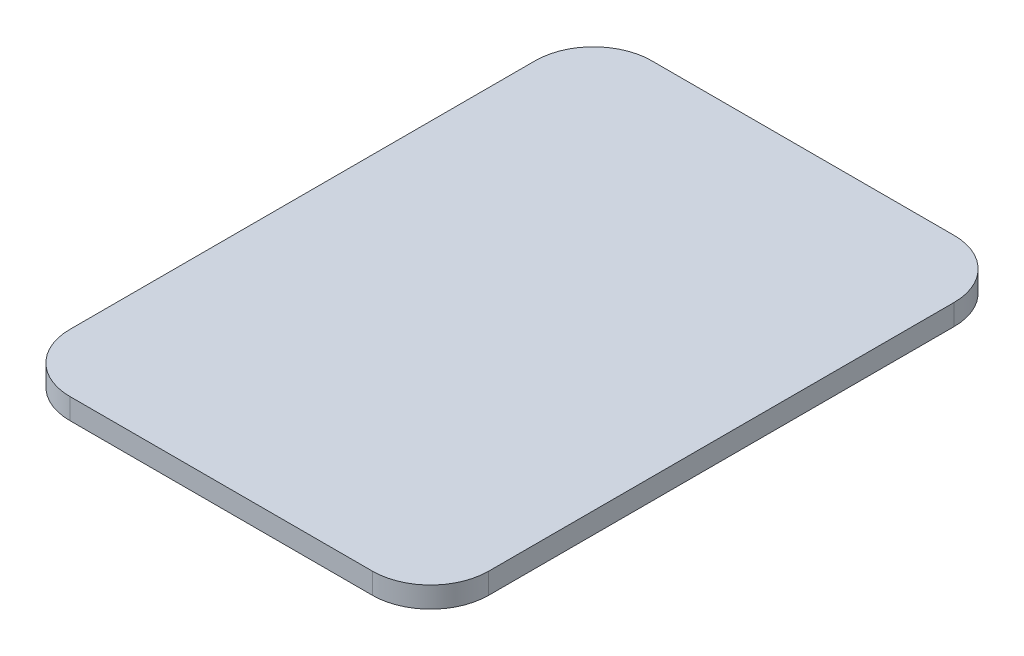
ISO-10303-21;
HEADER;
FILE_DESCRIPTION(('STEP AP214'),'2;1');
FILE_NAME('part.step','',(''),(''),'','','');
FILE_SCHEMA(('AUTOMOTIVE_DESIGN { 1 0 10303 214 1 1 1 1 }'));
ENDSEC;
DATA;
#1=APPLICATION_CONTEXT('core data for automotive mechanical design processes');
#2=APPLICATION_PROTOCOL_DEFINITION('international standard','automotive_design',2000,#1);
#3=PRODUCT_CONTEXT('',#1,'mechanical');
#4=PRODUCT('Part','Part','',(#3));
#5=PRODUCT_RELATED_PRODUCT_CATEGORY('part','',(#4));
#6=PRODUCT_DEFINITION_FORMATION('','',#4);
#7=PRODUCT_DEFINITION_CONTEXT('part definition',#1,'design');
#8=PRODUCT_DEFINITION('design','',#6,#7);
#9=PRODUCT_DEFINITION_SHAPE('','',#8);
#10=(LENGTH_UNIT() NAMED_UNIT(*) SI_UNIT(.MILLI.,.METRE.));
#11=(NAMED_UNIT(*) PLANE_ANGLE_UNIT() SI_UNIT($,.RADIAN.));
#12=(NAMED_UNIT(*) SI_UNIT($,.STERADIAN.) SOLID_ANGLE_UNIT());
#13=UNCERTAINTY_MEASURE_WITH_UNIT(LENGTH_MEASURE(1.E-05),#10,'distance_accuracy_value','');
#14=(GEOMETRIC_REPRESENTATION_CONTEXT(3) GLOBAL_UNCERTAINTY_ASSIGNED_CONTEXT((#13)) GLOBAL_UNIT_ASSIGNED_CONTEXT((#10,
#11,#12)) REPRESENTATION_CONTEXT('',''));
#15=CARTESIAN_POINT('',(0.,0.,0.));
#16=DIRECTION('',(0.,0.,1.));
#17=DIRECTION('',(1.,0.,0.));
#18=AXIS2_PLACEMENT_3D('',#15,#16,#17);
#19=CARTESIAN_POINT('',(65.,9.,-100.));
#20=DIRECTION('',(0.,-1.,0.));
#21=DIRECTION('',(0.,0.,-1.));
#22=AXIS2_PLACEMENT_3D('',#19,#20,#21);
#23=CYLINDRICAL_SURFACE('',#22,25.);
#24=CARTESIAN_POINT('',(65.,0.,-100.));
#25=DIRECTION('',(0.,1.,0.));
#26=DIRECTION('',(0.,0.,-1.));
#27=AXIS2_PLACEMENT_3D('',#24,#25,#26);
#28=CIRCLE('',#27,25.);
#29=CARTESIAN_POINT('',(90.,0.,-100.));
#30=VERTEX_POINT('',#29);
#31=CARTESIAN_POINT('',(65.,0.,-125.));
#32=VERTEX_POINT('',#31);
#33=EDGE_CURVE('E135',#30,#32,#28,.T.);
#34=ORIENTED_EDGE('',*,*,#33,.T.);
#35=DIRECTION('',(0.,-1.,0.));
#36=VECTOR('',#35,1.);
#37=CARTESIAN_POINT('',(65.,9.,-125.));
#38=LINE('',#37,#36);
#39=CARTESIAN_POINT('',(65.,9.,-125.));
#40=VERTEX_POINT('',#39);
#41=EDGE_CURVE('E11',#40,#32,#38,.T.);
#42=ORIENTED_EDGE('',*,*,#41,.F.);
#43=CARTESIAN_POINT('',(65.,9.,-100.));
#44=DIRECTION('',(0.,1.,0.));
#45=DIRECTION('',(0.,0.,-1.));
#46=AXIS2_PLACEMENT_3D('',#43,#44,#45);
#47=CIRCLE('',#46,25.);
#48=CARTESIAN_POINT('',(90.,9.,-100.));
#49=VERTEX_POINT('',#48);
#50=EDGE_CURVE('E149',#49,#40,#47,.T.);
#51=ORIENTED_EDGE('',*,*,#50,.F.);
#52=DIRECTION('',(0.,-1.,0.));
#53=VECTOR('',#52,1.);
#54=CARTESIAN_POINT('',(90.,9.,-100.));
#55=LINE('',#54,#53);
#56=EDGE_CURVE('E131',#49,#30,#55,.T.);
#57=ORIENTED_EDGE('',*,*,#56,.T.);
#58=EDGE_LOOP('',(#34,#42,#51,#57));
#59=FACE_BOUND('',#58,.T.);
#60=ADVANCED_FACE('F39',(#59),#23,.T.);
#61=CARTESIAN_POINT('',(-65.,9.,-125.));
#62=DIRECTION('',(0.,0.,1.));
#63=DIRECTION('',(1.,0.,0.));
#64=AXIS2_PLACEMENT_3D('',#61,#62,#63);
#65=PLANE('',#64);
#66=DIRECTION('',(-1.,0.,0.));
#67=VECTOR('',#66,1.);
#68=CARTESIAN_POINT('',(-65.,0.,-125.));
#69=LINE('',#68,#67);
#70=CARTESIAN_POINT('',(-65.,0.,-125.));
#71=VERTEX_POINT('',#70);
#72=EDGE_CURVE('E138',#32,#71,#69,.T.);
#73=ORIENTED_EDGE('',*,*,#72,.T.);
#74=DIRECTION('',(0.,-1.,0.));
#75=VECTOR('',#74,1.);
#76=CARTESIAN_POINT('',(-65.,9.,-125.));
#77=LINE('',#76,#75);
#78=CARTESIAN_POINT('',(-65.,9.,-125.));
#79=VERTEX_POINT('',#78);
#80=EDGE_CURVE('E47',#79,#71,#77,.T.);
#81=ORIENTED_EDGE('',*,*,#80,.F.);
#82=DIRECTION('',(-1.,0.,0.));
#83=VECTOR('',#82,1.);
#84=CARTESIAN_POINT('',(-65.,9.,-125.));
#85=LINE('',#84,#83);
#86=EDGE_CURVE('E98',#40,#79,#85,.T.);
#87=ORIENTED_EDGE('',*,*,#86,.F.);
#88=ORIENTED_EDGE('',*,*,#41,.T.);
#89=EDGE_LOOP('',(#73,#81,#87,#88));
#90=FACE_BOUND('',#89,.T.);
#91=ADVANCED_FACE('F184',(#90),#65,.F.);
#92=CARTESIAN_POINT('',(-65.,9.,-100.));
#93=DIRECTION('',(0.,-1.,0.));
#94=DIRECTION('',(0.,0.,-1.));
#95=AXIS2_PLACEMENT_3D('',#92,#93,#94);
#96=CYLINDRICAL_SURFACE('',#95,25.);
#97=CARTESIAN_POINT('',(-65.,0.,-100.));
#98=DIRECTION('',(0.,1.,0.));
#99=DIRECTION('',(0.,0.,-1.));
#100=AXIS2_PLACEMENT_3D('',#97,#98,#99);
#101=CIRCLE('',#100,25.);
#102=CARTESIAN_POINT('',(-90.,0.,-100.));
#103=VERTEX_POINT('',#102);
#104=EDGE_CURVE('E140',#71,#103,#101,.T.);
#105=ORIENTED_EDGE('',*,*,#104,.T.);
#106=DIRECTION('',(0.,-1.,0.));
#107=VECTOR('',#106,1.);
#108=CARTESIAN_POINT('',(-90.,9.,-100.));
#109=LINE('',#108,#107);
#110=CARTESIAN_POINT('',(-90.,9.,-100.));
#111=VERTEX_POINT('',#110);
#112=EDGE_CURVE('E156',#111,#103,#109,.T.);
#113=ORIENTED_EDGE('',*,*,#112,.F.);
#114=CARTESIAN_POINT('',(-65.,9.,-100.));
#115=DIRECTION('',(0.,1.,0.));
#116=DIRECTION('',(0.,0.,-1.));
#117=AXIS2_PLACEMENT_3D('',#114,#115,#116);
#118=CIRCLE('',#117,25.);
#119=EDGE_CURVE('E164',#79,#111,#118,.T.);
#120=ORIENTED_EDGE('',*,*,#119,.F.);
#121=ORIENTED_EDGE('',*,*,#80,.T.);
#122=EDGE_LOOP('',(#105,#113,#120,#121));
#123=FACE_BOUND('',#122,.T.);
#124=ADVANCED_FACE('F162',(#123),#96,.T.);
#125=CARTESIAN_POINT('',(-90.,9.,100.));
#126=DIRECTION('',(1.,0.,0.));
#127=DIRECTION('',(0.,0.,-1.));
#128=AXIS2_PLACEMENT_3D('',#125,#126,#127);
#129=PLANE('',#128);
#130=DIRECTION('',(0.,0.,1.));
#131=VECTOR('',#130,1.);
#132=CARTESIAN_POINT('',(-90.,0.,100.));
#133=LINE('',#132,#131);
#134=CARTESIAN_POINT('',(-90.,0.,100.));
#135=VERTEX_POINT('',#134);
#136=EDGE_CURVE('E142',#103,#135,#133,.T.);
#137=ORIENTED_EDGE('',*,*,#136,.T.);
#138=DIRECTION('',(0.,-1.,0.));
#139=VECTOR('',#138,1.);
#140=CARTESIAN_POINT('',(-90.,9.,100.));
#141=LINE('',#140,#139);
#142=CARTESIAN_POINT('',(-90.,9.,100.));
#143=VERTEX_POINT('',#142);
#144=EDGE_CURVE('E153',#143,#135,#141,.T.);
#145=ORIENTED_EDGE('',*,*,#144,.F.);
#146=DIRECTION('',(0.,0.,1.));
#147=VECTOR('',#146,1.);
#148=CARTESIAN_POINT('',(-90.,9.,100.));
#149=LINE('',#148,#147);
#150=EDGE_CURVE('E176',#111,#143,#149,.T.);
#151=ORIENTED_EDGE('',*,*,#150,.F.);
#152=ORIENTED_EDGE('',*,*,#112,.T.);
#153=EDGE_LOOP('',(#137,#145,#151,#152));
#154=FACE_BOUND('',#153,.T.);
#155=ADVANCED_FACE('F172',(#154),#129,.F.);
#156=CARTESIAN_POINT('',(-65.,9.,100.));
#157=DIRECTION('',(0.,-1.,0.));
#158=DIRECTION('',(0.,0.,-1.));
#159=AXIS2_PLACEMENT_3D('',#156,#157,#158);
#160=CYLINDRICAL_SURFACE('',#159,25.);
#161=CARTESIAN_POINT('',(-65.,0.,100.));
#162=DIRECTION('',(0.,1.,0.));
#163=DIRECTION('',(0.,0.,-1.));
#164=AXIS2_PLACEMENT_3D('',#161,#162,#163);
#165=CIRCLE('',#164,25.);
#166=CARTESIAN_POINT('',(-65.,0.,125.));
#167=VERTEX_POINT('',#166);
#168=EDGE_CURVE('E144',#135,#167,#165,.T.);
#169=ORIENTED_EDGE('',*,*,#168,.T.);
#170=DIRECTION('',(0.,-1.,0.));
#171=VECTOR('',#170,1.);
#172=CARTESIAN_POINT('',(-65.,9.,125.));
#173=LINE('',#172,#171);
#174=CARTESIAN_POINT('',(-65.,9.,125.));
#175=VERTEX_POINT('',#174);
#176=EDGE_CURVE('E126',#175,#167,#173,.T.);
#177=ORIENTED_EDGE('',*,*,#176,.F.);
#178=CARTESIAN_POINT('',(-65.,9.,100.));
#179=DIRECTION('',(0.,1.,0.));
#180=DIRECTION('',(0.,0.,-1.));
#181=AXIS2_PLACEMENT_3D('',#178,#179,#180);
#182=CIRCLE('',#181,25.);
#183=EDGE_CURVE('E117',#143,#175,#182,.T.);
#184=ORIENTED_EDGE('',*,*,#183,.F.);
#185=ORIENTED_EDGE('',*,*,#144,.T.);
#186=EDGE_LOOP('',(#169,#177,#184,#185));
#187=FACE_BOUND('',#186,.T.);
#188=ADVANCED_FACE('F175',(#187),#160,.T.);
#189=CARTESIAN_POINT('',(-65.,9.,125.));
#190=DIRECTION('',(0.,0.,-1.));
#191=DIRECTION('',(-1.,0.,0.));
#192=AXIS2_PLACEMENT_3D('',#189,#190,#191);
#193=PLANE('',#192);
#194=DIRECTION('',(1.,0.,0.));
#195=VECTOR('',#194,1.);
#196=CARTESIAN_POINT('',(-65.,0.,125.));
#197=LINE('',#196,#195);
#198=CARTESIAN_POINT('',(65.,0.,125.));
#199=VERTEX_POINT('',#198);
#200=EDGE_CURVE('E125',#167,#199,#197,.T.);
#201=ORIENTED_EDGE('',*,*,#200,.T.);
#202=DIRECTION('',(0.,-1.,0.));
#203=VECTOR('',#202,1.);
#204=CARTESIAN_POINT('',(65.,9.,125.));
#205=LINE('',#204,#203);
#206=CARTESIAN_POINT('',(65.,9.,125.));
#207=VERTEX_POINT('',#206);
#208=EDGE_CURVE('E122',#207,#199,#205,.T.);
#209=ORIENTED_EDGE('',*,*,#208,.F.);
#210=DIRECTION('',(1.,0.,0.));
#211=VECTOR('',#210,1.);
#212=CARTESIAN_POINT('',(-65.,9.,125.));
#213=LINE('',#212,#211);
#214=EDGE_CURVE('E111',#175,#207,#213,.T.);
#215=ORIENTED_EDGE('',*,*,#214,.F.);
#216=ORIENTED_EDGE('',*,*,#176,.T.);
#217=EDGE_LOOP('',(#201,#209,#215,#216));
#218=FACE_BOUND('',#217,.T.);
#219=ADVANCED_FACE('F123',(#218),#193,.F.);
#220=CARTESIAN_POINT('',(65.,9.,100.));
#221=DIRECTION('',(0.,-1.,0.));
#222=DIRECTION('',(0.,0.,-1.));
#223=AXIS2_PLACEMENT_3D('',#220,#221,#222);
#224=CYLINDRICAL_SURFACE('',#223,25.);
#225=CARTESIAN_POINT('',(65.,0.,100.));
#226=DIRECTION('',(0.,1.,0.));
#227=DIRECTION('',(0.,0.,-1.));
#228=AXIS2_PLACEMENT_3D('',#225,#226,#227);
#229=CIRCLE('',#228,25.);
#230=CARTESIAN_POINT('',(90.,0.,100.));
#231=VERTEX_POINT('',#230);
#232=EDGE_CURVE('E84',#199,#231,#229,.T.);
#233=ORIENTED_EDGE('',*,*,#232,.T.);
#234=DIRECTION('',(0.,-1.,0.));
#235=VECTOR('',#234,1.);
#236=CARTESIAN_POINT('',(90.,9.,100.));
#237=LINE('',#236,#235);
#238=CARTESIAN_POINT('',(90.,9.,100.));
#239=VERTEX_POINT('',#238);
#240=EDGE_CURVE('E127',#239,#231,#237,.T.);
#241=ORIENTED_EDGE('',*,*,#240,.F.);
#242=CARTESIAN_POINT('',(65.,9.,100.));
#243=DIRECTION('',(0.,1.,0.));
#244=DIRECTION('',(0.,0.,-1.));
#245=AXIS2_PLACEMENT_3D('',#242,#243,#244);
#246=CIRCLE('',#245,25.);
#247=EDGE_CURVE('E115',#207,#239,#246,.T.);
#248=ORIENTED_EDGE('',*,*,#247,.F.);
#249=ORIENTED_EDGE('',*,*,#208,.T.);
#250=EDGE_LOOP('',(#233,#241,#248,#249));
#251=FACE_BOUND('',#250,.T.);
#252=ADVANCED_FACE('F129',(#251),#224,.T.);
#253=CARTESIAN_POINT('',(90.,9.,100.));
#254=DIRECTION('',(-1.,0.,0.));
#255=DIRECTION('',(0.,0.,1.));
#256=AXIS2_PLACEMENT_3D('',#253,#254,#255);
#257=PLANE('',#256);
#258=DIRECTION('',(0.,0.,-1.));
#259=VECTOR('',#258,1.);
#260=CARTESIAN_POINT('',(90.,0.,100.));
#261=LINE('',#260,#259);
#262=EDGE_CURVE('E90',#231,#30,#261,.T.);
#263=ORIENTED_EDGE('',*,*,#262,.T.);
#264=ORIENTED_EDGE('',*,*,#56,.F.);
#265=DIRECTION('',(0.,0.,-1.));
#266=VECTOR('',#265,1.);
#267=CARTESIAN_POINT('',(90.,9.,100.));
#268=LINE('',#267,#266);
#269=EDGE_CURVE('E55',#239,#49,#268,.T.);
#270=ORIENTED_EDGE('',*,*,#269,.F.);
#271=ORIENTED_EDGE('',*,*,#240,.T.);
#272=EDGE_LOOP('',(#263,#264,#270,#271));
#273=FACE_BOUND('',#272,.T.);
#274=ADVANCED_FACE('F200',(#273),#257,.F.);
#275=CARTESIAN_POINT('',(65.,9.,-100.));
#276=DIRECTION('',(0.,-1.,0.));
#277=DIRECTION('',(0.,0.,-1.));
#278=AXIS2_PLACEMENT_3D('',#275,#276,#277);
#279=PLANE('',#278);
#280=ORIENTED_EDGE('',*,*,#50,.T.);
#281=ORIENTED_EDGE('',*,*,#86,.T.);
#282=ORIENTED_EDGE('',*,*,#119,.T.);
#283=ORIENTED_EDGE('',*,*,#150,.T.);
#284=ORIENTED_EDGE('',*,*,#183,.T.);
#285=ORIENTED_EDGE('',*,*,#214,.T.);
#286=ORIENTED_EDGE('',*,*,#247,.T.);
#287=ORIENTED_EDGE('',*,*,#269,.T.);
#288=EDGE_LOOP('',(#280,#281,#282,#283,#284,#285,#286,#287));
#289=FACE_BOUND('',#288,.T.);
#290=ADVANCED_FACE('F113',(#289),#279,.F.);
#291=CARTESIAN_POINT('',(65.,0.,-100.));
#292=DIRECTION('',(0.,-1.,0.));
#293=DIRECTION('',(0.,0.,-1.));
#294=AXIS2_PLACEMENT_3D('',#291,#292,#293);
#295=PLANE('',#294);
#296=ORIENTED_EDGE('',*,*,#33,.F.);
#297=ORIENTED_EDGE('',*,*,#262,.F.);
#298=ORIENTED_EDGE('',*,*,#232,.F.);
#299=ORIENTED_EDGE('',*,*,#200,.F.);
#300=ORIENTED_EDGE('',*,*,#168,.F.);
#301=ORIENTED_EDGE('',*,*,#136,.F.);
#302=ORIENTED_EDGE('',*,*,#104,.F.);
#303=ORIENTED_EDGE('',*,*,#72,.F.);
#304=EDGE_LOOP('',(#296,#297,#298,#299,#300,#301,#302,#303));
#305=FACE_BOUND('',#304,.T.);
#306=ADVANCED_FACE('F168',(#305),#295,.T.);
#307=CLOSED_SHELL('',(#60,#91,#124,#155,#188,#219,#252,#274,#290,#306));
#308=MANIFOLD_SOLID_BREP('B2',#307);
#309=ADVANCED_BREP_SHAPE_REPRESENTATION('',(#18,#308),#14);
#310=SHAPE_DEFINITION_REPRESENTATION(#9,#309);
ENDSEC;
END-ISO-10303-21;
